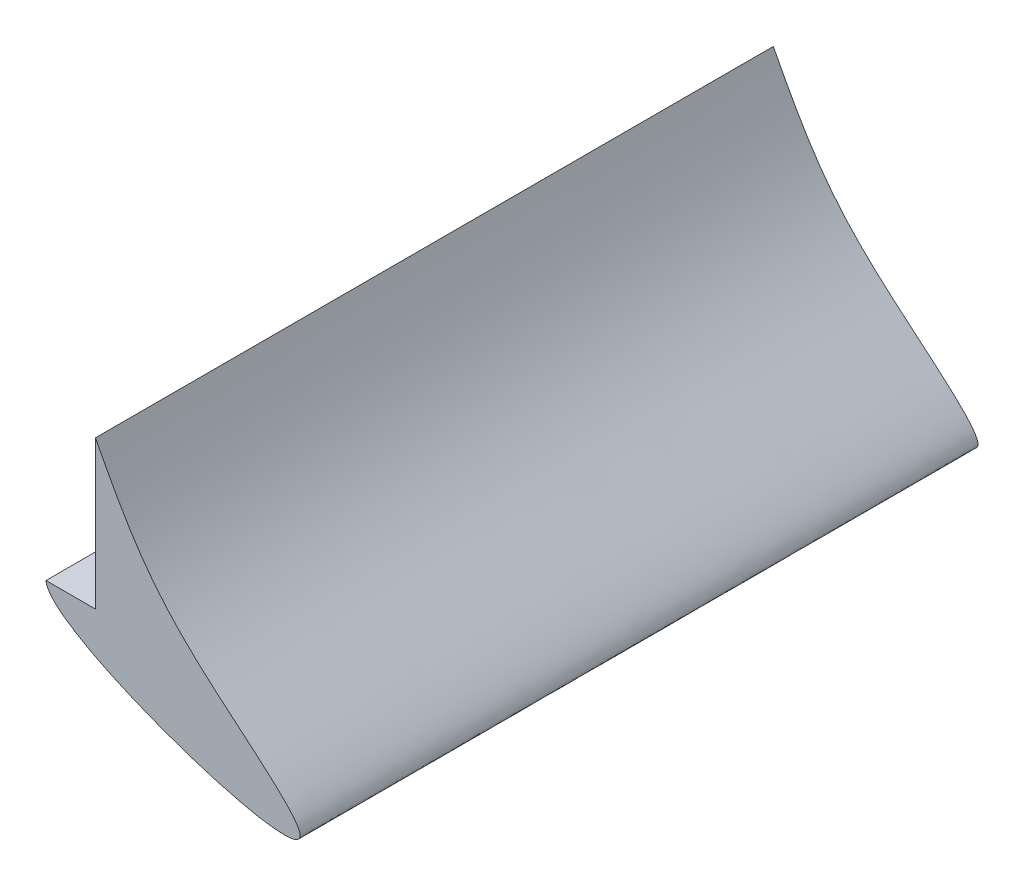
ISO-10303-21;
HEADER;
FILE_DESCRIPTION(('STEP AP214'),'2;1');
FILE_NAME('part.step','',(''),(''),'','','');
FILE_SCHEMA(('AUTOMOTIVE_DESIGN { 1 0 10303 214 1 1 1 1 }'));
ENDSEC;
DATA;
#1=APPLICATION_CONTEXT('core data for automotive mechanical design processes');
#2=APPLICATION_PROTOCOL_DEFINITION('international standard','automotive_design',2000,#1);
#3=PRODUCT_CONTEXT('',#1,'mechanical');
#4=PRODUCT('Part','Part','',(#3));
#5=PRODUCT_RELATED_PRODUCT_CATEGORY('part','',(#4));
#6=PRODUCT_DEFINITION_FORMATION('','',#4);
#7=PRODUCT_DEFINITION_CONTEXT('part definition',#1,'design');
#8=PRODUCT_DEFINITION('design','',#6,#7);
#9=PRODUCT_DEFINITION_SHAPE('','',#8);
#10=(LENGTH_UNIT() NAMED_UNIT(*) SI_UNIT(.MILLI.,.METRE.));
#11=(NAMED_UNIT(*) PLANE_ANGLE_UNIT() SI_UNIT($,.RADIAN.));
#12=(NAMED_UNIT(*) SI_UNIT($,.STERADIAN.) SOLID_ANGLE_UNIT());
#13=UNCERTAINTY_MEASURE_WITH_UNIT(LENGTH_MEASURE(1.E-05),#10,'distance_accuracy_value','');
#14=(GEOMETRIC_REPRESENTATION_CONTEXT(3) GLOBAL_UNCERTAINTY_ASSIGNED_CONTEXT((#13)) GLOBAL_UNIT_ASSIGNED_CONTEXT((#10,
#11,#12)) REPRESENTATION_CONTEXT('',''));
#15=CARTESIAN_POINT('',(0.,0.,0.));
#16=DIRECTION('',(0.,0.,1.));
#17=DIRECTION('',(1.,0.,0.));
#18=AXIS2_PLACEMENT_3D('',#15,#16,#17);
#19=CARTESIAN_POINT('',(0.,0.,68.58));
#20=CARTESIAN_POINT('',(0.287516010923704,-4.18956837146252,68.58));
#21=CARTESIAN_POINT('',(37.8176570621631,-16.8739107443964,68.58));
#22=CARTESIAN_POINT('',(11.9308323597046,2.27657716824983,68.58));
#23=CARTESIAN_POINT('',(8.32097676032294,8.64620176199009,68.58));
#24=CARTESIAN_POINT('',(5.,15.,68.58));
#25=B_SPLINE_CURVE_WITH_KNOTS('',3,(#19,#20,#21,#22,#23,#24),.UNSPECIFIED.,.F.,.F.,(4,1,1,4),
(0.,0.463325363684337,0.690507290273913,1.),.UNSPECIFIED.);
#26=DIRECTION('',(0.,0.,-1.));
#27=VECTOR('',#26,1.);
#28=SURFACE_OF_LINEAR_EXTRUSION('',#25,#27);
#29=CARTESIAN_POINT('',(0.,0.,0.));
#30=CARTESIAN_POINT('',(0.287516010923704,-4.18956837146252,0.));
#31=CARTESIAN_POINT('',(37.8176570621631,-16.8739107443964,0.));
#32=CARTESIAN_POINT('',(11.9308323597046,2.27657716824983,0.));
#33=CARTESIAN_POINT('',(8.32097676032294,8.64620176199009,0.));
#34=CARTESIAN_POINT('',(5.,15.,0.));
#35=B_SPLINE_CURVE_WITH_KNOTS('',3,(#29,#30,#31,#32,#33,#34),.UNSPECIFIED.,.F.,.F.,(4,1,1,4),
(0.,0.463325363684337,0.690507290273913,1.),.UNSPECIFIED.);
#36=CARTESIAN_POINT('',(0.,0.,0.));
#37=VERTEX_POINT('',#36);
#38=CARTESIAN_POINT('',(5.,15.,0.));
#39=VERTEX_POINT('',#38);
#40=EDGE_CURVE('E80',#37,#39,#35,.T.);
#41=ORIENTED_EDGE('',*,*,#40,.T.);
#42=DIRECTION('',(0.,0.,-1.));
#43=VECTOR('',#42,1.);
#44=CARTESIAN_POINT('',(5.,15.,68.58));
#45=LINE('',#44,#43);
#46=CARTESIAN_POINT('',(5.,15.,68.58));
#47=VERTEX_POINT('',#46);
#48=EDGE_CURVE('E11',#47,#39,#45,.T.);
#49=ORIENTED_EDGE('',*,*,#48,.F.);
#50=CARTESIAN_POINT('',(0.,0.,68.58));
#51=VERTEX_POINT('',#50);
#52=EDGE_CURVE('E74',#51,#47,#25,.T.);
#53=ORIENTED_EDGE('',*,*,#52,.F.);
#54=DIRECTION('',(0.,0.,-1.));
#55=VECTOR('',#54,1.);
#56=CARTESIAN_POINT('',(0.,0.,68.58));
#57=LINE('',#56,#55);
#58=EDGE_CURVE('E81',#51,#37,#57,.T.);
#59=ORIENTED_EDGE('',*,*,#58,.T.);
#60=EDGE_LOOP('',(#41,#49,#53,#59));
#61=FACE_BOUND('',#60,.T.);
#62=ADVANCED_FACE('F33',(#61),#28,.F.);
#63=CARTESIAN_POINT('',(5.,0.,68.58));
#64=DIRECTION('',(1.,0.,0.));
#65=DIRECTION('',(0.,0.,-1.));
#66=AXIS2_PLACEMENT_3D('',#63,#64,#65);
#67=PLANE('',#66);
#68=DIRECTION('',(0.,-1.,0.));
#69=VECTOR('',#68,1.);
#70=CARTESIAN_POINT('',(5.,0.,0.));
#71=LINE('',#70,#69);
#72=CARTESIAN_POINT('',(5.,0.,0.));
#73=VERTEX_POINT('',#72);
#74=EDGE_CURVE('E62',#39,#73,#71,.T.);
#75=ORIENTED_EDGE('',*,*,#74,.T.);
#76=DIRECTION('',(0.,0.,-1.));
#77=VECTOR('',#76,1.);
#78=CARTESIAN_POINT('',(5.,0.,68.58));
#79=LINE('',#78,#77);
#80=CARTESIAN_POINT('',(5.,0.,68.58));
#81=VERTEX_POINT('',#80);
#82=EDGE_CURVE('E42',#81,#73,#79,.T.);
#83=ORIENTED_EDGE('',*,*,#82,.F.);
#84=DIRECTION('',(0.,-1.,0.));
#85=VECTOR('',#84,1.);
#86=CARTESIAN_POINT('',(5.,0.,68.58));
#87=LINE('',#86,#85);
#88=EDGE_CURVE('E70',#47,#81,#87,.T.);
#89=ORIENTED_EDGE('',*,*,#88,.F.);
#90=ORIENTED_EDGE('',*,*,#48,.T.);
#91=EDGE_LOOP('',(#75,#83,#89,#90));
#92=FACE_BOUND('',#91,.T.);
#93=ADVANCED_FACE('F71',(#92),#67,.F.);
#94=CARTESIAN_POINT('',(0.,0.,68.58));
#95=DIRECTION('',(0.,-1.,0.));
#96=DIRECTION('',(0.,0.,-1.));
#97=AXIS2_PLACEMENT_3D('',#94,#95,#96);
#98=PLANE('',#97);
#99=DIRECTION('',(-1.,0.,0.));
#100=VECTOR('',#99,1.);
#101=CARTESIAN_POINT('',(0.,0.,0.));
#102=LINE('',#101,#100);
#103=EDGE_CURVE('E67',#73,#37,#102,.T.);
#104=ORIENTED_EDGE('',*,*,#103,.T.);
#105=ORIENTED_EDGE('',*,*,#58,.F.);
#106=DIRECTION('',(-1.,0.,0.));
#107=VECTOR('',#106,1.);
#108=CARTESIAN_POINT('',(0.,0.,68.58));
#109=LINE('',#108,#107);
#110=EDGE_CURVE('E50',#81,#51,#109,.T.);
#111=ORIENTED_EDGE('',*,*,#110,.F.);
#112=ORIENTED_EDGE('',*,*,#82,.T.);
#113=EDGE_LOOP('',(#104,#105,#111,#112));
#114=FACE_BOUND('',#113,.T.);
#115=ADVANCED_FACE('F93',(#114),#98,.F.);
#116=CARTESIAN_POINT('',(25.3277258995521,-8.59388379626734,68.58));
#117=DIRECTION('',(0.,0.,-1.));
#118=DIRECTION('',(-1.,0.,0.));
#119=AXIS2_PLACEMENT_3D('',#116,#117,#118);
#120=PLANE('',#119);
#121=ORIENTED_EDGE('',*,*,#52,.T.);
#122=ORIENTED_EDGE('',*,*,#88,.T.);
#123=ORIENTED_EDGE('',*,*,#110,.T.);
#124=EDGE_LOOP('',(#121,#122,#123));
#125=FACE_BOUND('',#124,.T.);
#126=ADVANCED_FACE('F77',(#125),#120,.F.);
#127=CARTESIAN_POINT('',(25.3277258995521,-8.59388379626734,0.));
#128=DIRECTION('',(0.,0.,-1.));
#129=DIRECTION('',(-1.,0.,0.));
#130=AXIS2_PLACEMENT_3D('',#127,#128,#129);
#131=PLANE('',#130);
#132=ORIENTED_EDGE('',*,*,#40,.F.);
#133=ORIENTED_EDGE('',*,*,#103,.F.);
#134=ORIENTED_EDGE('',*,*,#74,.F.);
#135=EDGE_LOOP('',(#132,#133,#134));
#136=FACE_BOUND('',#135,.T.);
#137=ADVANCED_FACE('F94',(#136),#131,.T.);
#138=CLOSED_SHELL('',(#62,#93,#115,#126,#137));
#139=MANIFOLD_SOLID_BREP('B2',#138);
#140=ADVANCED_BREP_SHAPE_REPRESENTATION('',(#18,#139),#14);
#141=SHAPE_DEFINITION_REPRESENTATION(#9,#140);
ENDSEC;
END-ISO-10303-21;
